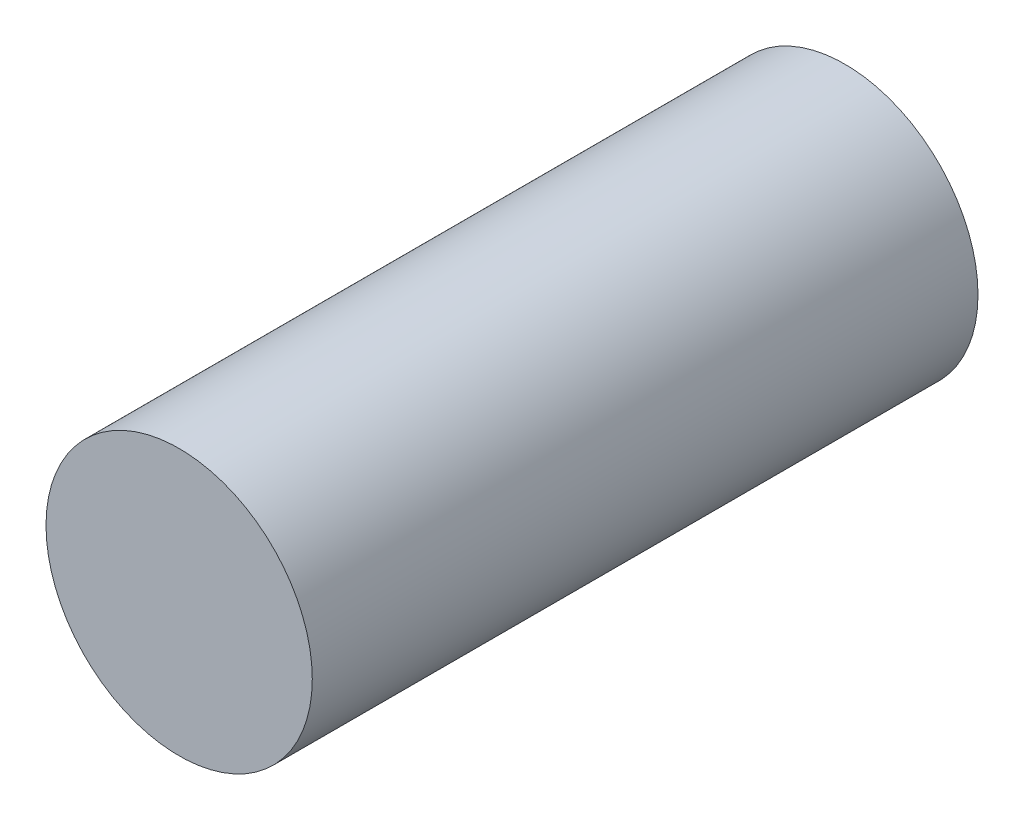
ISO-10303-21;
HEADER;
FILE_DESCRIPTION(('STEP AP214'),'2;1');
FILE_NAME('part.step','',(''),(''),'','','');
FILE_SCHEMA(('AUTOMOTIVE_DESIGN { 1 0 10303 214 1 1 1 1 }'));
ENDSEC;
DATA;
#1=APPLICATION_CONTEXT('core data for automotive mechanical design processes');
#2=APPLICATION_PROTOCOL_DEFINITION('international standard','automotive_design',2000,#1);
#3=PRODUCT_CONTEXT('',#1,'mechanical');
#4=PRODUCT('Part','Part','',(#3));
#5=PRODUCT_RELATED_PRODUCT_CATEGORY('part','',(#4));
#6=PRODUCT_DEFINITION_FORMATION('','',#4);
#7=PRODUCT_DEFINITION_CONTEXT('part definition',#1,'design');
#8=PRODUCT_DEFINITION('design','',#6,#7);
#9=PRODUCT_DEFINITION_SHAPE('','',#8);
#10=(LENGTH_UNIT() NAMED_UNIT(*) SI_UNIT(.MILLI.,.METRE.));
#11=(NAMED_UNIT(*) PLANE_ANGLE_UNIT() SI_UNIT($,.RADIAN.));
#12=(NAMED_UNIT(*) SI_UNIT($,.STERADIAN.) SOLID_ANGLE_UNIT());
#13=UNCERTAINTY_MEASURE_WITH_UNIT(LENGTH_MEASURE(1.E-05),#10,'distance_accuracy_value','');
#14=(GEOMETRIC_REPRESENTATION_CONTEXT(3) GLOBAL_UNCERTAINTY_ASSIGNED_CONTEXT((#13)) GLOBAL_UNIT_ASSIGNED_CONTEXT((#10,
#11,#12)) REPRESENTATION_CONTEXT('',''));
#15=CARTESIAN_POINT('',(0.,0.,0.));
#16=DIRECTION('',(0.,0.,1.));
#17=DIRECTION('',(1.,0.,0.));
#18=AXIS2_PLACEMENT_3D('',#15,#16,#17);
#19=CARTESIAN_POINT('',(0.,0.,40.));
#20=DIRECTION('',(0.,0.,-1.));
#21=DIRECTION('',(-1.,0.,0.));
#22=AXIS2_PLACEMENT_3D('',#19,#20,#21);
#23=CYLINDRICAL_SURFACE('',#22,8.);
#24=CARTESIAN_POINT('',(0.,0.,40.));
#25=DIRECTION('',(0.,0.,1.));
#26=DIRECTION('',(1.,0.,0.));
#27=AXIS2_PLACEMENT_3D('',#24,#25,#26);
#28=CIRCLE('',#27,8.);
#29=CARTESIAN_POINT('',(8.,0.,40.));
#30=VERTEX_POINT('',#29);
#31=EDGE_CURVE('E10',#30,#30,#28,.T.);
#32=ORIENTED_EDGE('',*,*,#31,.F.);
#33=EDGE_LOOP('',(#32));
#34=FACE_BOUND('',#33,.T.);
#35=CARTESIAN_POINT('',(0.,0.,0.));
#36=DIRECTION('',(0.,0.,1.));
#37=DIRECTION('',(1.,0.,0.));
#38=AXIS2_PLACEMENT_3D('',#35,#36,#37);
#39=CIRCLE('',#38,8.);
#40=CARTESIAN_POINT('',(8.,0.,0.));
#41=VERTEX_POINT('',#40);
#42=EDGE_CURVE('E40',#41,#41,#39,.T.);
#43=ORIENTED_EDGE('',*,*,#42,.T.);
#44=EDGE_LOOP('',(#43));
#45=FACE_BOUND('',#44,.T.);
#46=ADVANCED_FACE('F37',(#34,#45),#23,.T.);
#47=CARTESIAN_POINT('',(0.,0.,40.));
#48=DIRECTION('',(0.,0.,1.));
#49=DIRECTION('',(1.,0.,0.));
#50=AXIS2_PLACEMENT_3D('',#47,#48,#49);
#51=PLANE('',#50);
#52=ORIENTED_EDGE('',*,*,#31,.T.);
#53=EDGE_LOOP('',(#52));
#54=FACE_BOUND('',#53,.T.);
#55=ADVANCED_FACE('F54',(#54),#51,.T.);
#56=CARTESIAN_POINT('',(0.,0.,0.));
#57=DIRECTION('',(0.,0.,1.));
#58=DIRECTION('',(1.,0.,0.));
#59=AXIS2_PLACEMENT_3D('',#56,#57,#58);
#60=PLANE('',#59);
#61=ORIENTED_EDGE('',*,*,#42,.F.);
#62=EDGE_LOOP('',(#61));
#63=FACE_BOUND('',#62,.T.);
#64=ADVANCED_FACE('F52',(#63),#60,.F.);
#65=CLOSED_SHELL('',(#46,#55,#64));
#66=MANIFOLD_SOLID_BREP('B2',#65);
#67=ADVANCED_BREP_SHAPE_REPRESENTATION('',(#18,#66),#14);
#68=SHAPE_DEFINITION_REPRESENTATION(#9,#67);
ENDSEC;
END-ISO-10303-21;
